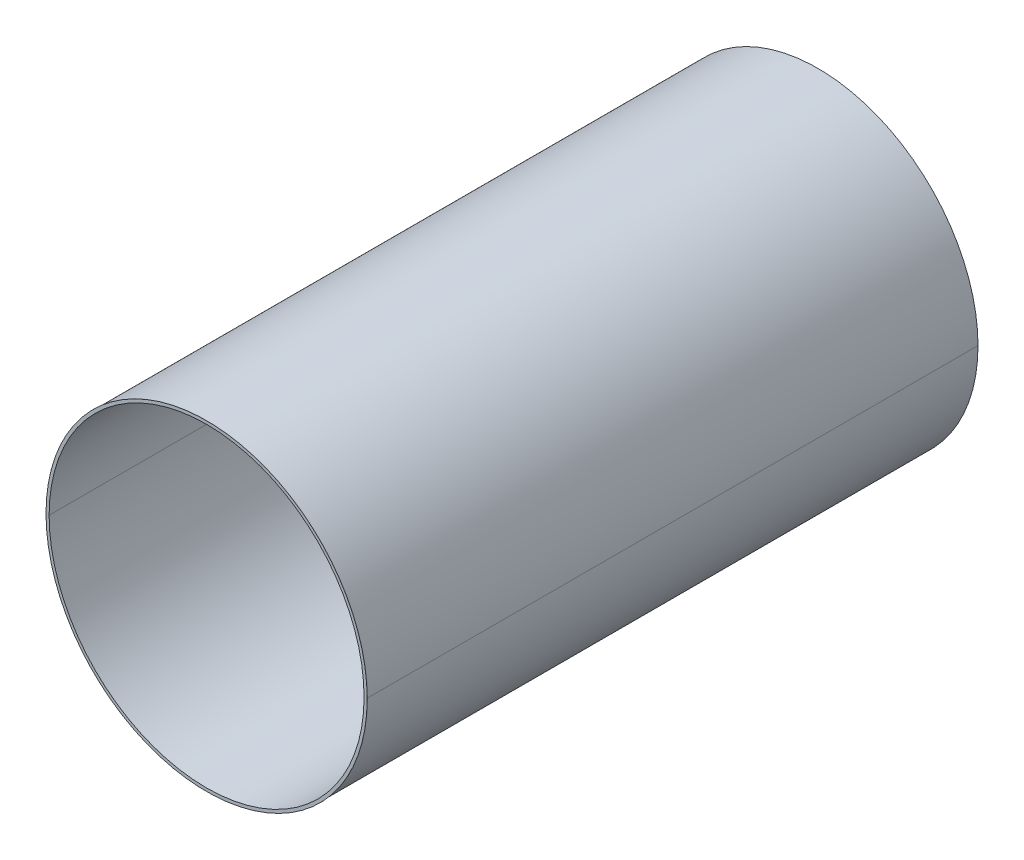
ISO-10303-21;
HEADER;
FILE_DESCRIPTION(('STEP AP214'),'2;1');
FILE_NAME('part.step','',(''),(''),'','','');
FILE_SCHEMA(('AUTOMOTIVE_DESIGN { 1 0 10303 214 1 1 1 1 }'));
ENDSEC;
DATA;
#1=APPLICATION_CONTEXT('core data for automotive mechanical design processes');
#2=APPLICATION_PROTOCOL_DEFINITION('international standard','automotive_design',2000,#1);
#3=PRODUCT_CONTEXT('',#1,'mechanical');
#4=PRODUCT('Part','Part','',(#3));
#5=PRODUCT_RELATED_PRODUCT_CATEGORY('part','',(#4));
#6=PRODUCT_DEFINITION_FORMATION('','',#4);
#7=PRODUCT_DEFINITION_CONTEXT('part definition',#1,'design');
#8=PRODUCT_DEFINITION('design','',#6,#7);
#9=PRODUCT_DEFINITION_SHAPE('','',#8);
#10=(LENGTH_UNIT() NAMED_UNIT(*) SI_UNIT(.MILLI.,.METRE.));
#11=(NAMED_UNIT(*) PLANE_ANGLE_UNIT() SI_UNIT($,.RADIAN.));
#12=(NAMED_UNIT(*) SI_UNIT($,.STERADIAN.) SOLID_ANGLE_UNIT());
#13=UNCERTAINTY_MEASURE_WITH_UNIT(LENGTH_MEASURE(1.E-05),#10,'distance_accuracy_value','');
#14=(GEOMETRIC_REPRESENTATION_CONTEXT(3) GLOBAL_UNCERTAINTY_ASSIGNED_CONTEXT((#13)) GLOBAL_UNIT_ASSIGNED_CONTEXT((#10,
#11,#12)) REPRESENTATION_CONTEXT('',''));
#15=CARTESIAN_POINT('',(0.,0.,0.));
#16=DIRECTION('',(0.,0.,1.));
#17=DIRECTION('',(1.,0.,0.));
#18=AXIS2_PLACEMENT_3D('',#15,#16,#17);
#19=CARTESIAN_POINT('',(-78.36,1.5875,-299.260099631724));
#20=DIRECTION('',(0.,0.,1.));
#21=DIRECTION('',(1.,0.,0.));
#22=AXIS2_PLACEMENT_3D('',#19,#20,#21);
#23=PLANE('',#22);
#24=CARTESIAN_POINT('',(-78.36,1.5875,-299.260099631724));
#25=DIRECTION('',(0.,0.,-1.));
#26=DIRECTION('',(1.,0.,0.));
#27=AXIS2_PLACEMENT_3D('',#24,#25,#26);
#28=CIRCLE('',#27,77.09);
#29=CARTESIAN_POINT('',(-1.27,1.5875,-299.260099631724));
#30=VERTEX_POINT('',#29);
#31=CARTESIAN_POINT('',(-155.45,1.5875,-299.260099631724));
#32=VERTEX_POINT('',#31);
#33=EDGE_CURVE('E118',#30,#32,#28,.T.);
#34=ORIENTED_EDGE('',*,*,#33,.F.);
#35=CARTESIAN_POINT('',(-78.36,1.5875,-299.260099631724));
#36=DIRECTION('',(0.,0.,-1.));
#37=DIRECTION('',(1.,0.,0.));
#38=AXIS2_PLACEMENT_3D('',#35,#36,#37);
#39=CIRCLE('',#38,77.09);
#40=EDGE_CURVE('E141',#32,#30,#39,.T.);
#41=ORIENTED_EDGE('',*,*,#40,.F.);
#42=EDGE_LOOP('',(#34,#41));
#43=FACE_BOUND('',#42,.T.);
#44=CARTESIAN_POINT('',(-78.36,1.5875,-299.260099631724));
#45=DIRECTION('',(0.,0.,-1.));
#46=DIRECTION('',(1.,0.,0.));
#47=AXIS2_PLACEMENT_3D('',#44,#45,#46);
#48=CIRCLE('',#47,78.36);
#49=CARTESIAN_POINT('',(0.,1.5875,-299.260099631724));
#50=VERTEX_POINT('',#49);
#51=CARTESIAN_POINT('',(-156.72,1.5875,-299.260099631724));
#52=VERTEX_POINT('',#51);
#53=EDGE_CURVE('E112',#50,#52,#48,.T.);
#54=ORIENTED_EDGE('',*,*,#53,.T.);
#55=CARTESIAN_POINT('',(-78.36,1.5875,-299.260099631724));
#56=DIRECTION('',(0.,0.,-1.));
#57=DIRECTION('',(1.,0.,0.));
#58=AXIS2_PLACEMENT_3D('',#55,#56,#57);
#59=CIRCLE('',#58,78.36);
#60=EDGE_CURVE('E103',#52,#50,#59,.T.);
#61=ORIENTED_EDGE('',*,*,#60,.T.);
#62=EDGE_LOOP('',(#54,#61));
#63=FACE_BOUND('',#62,.T.);
#64=ADVANCED_FACE('F16',(#43,#63),#23,.F.);
#65=CARTESIAN_POINT('',(0.,0.,-0.1));
#66=DIRECTION('',(0.,0.,1.));
#67=DIRECTION('',(1.,0.,0.));
#68=AXIS2_PLACEMENT_3D('',#65,#66,#67);
#69=PLANE('',#68);
#70=CARTESIAN_POINT('',(-78.36,1.5875,-0.099999999999989));
#71=DIRECTION('',(0.,0.,-1.));
#72=DIRECTION('',(1.,0.,0.));
#73=AXIS2_PLACEMENT_3D('',#70,#71,#72);
#74=CIRCLE('',#73,78.36);
#75=CARTESIAN_POINT('',(0.,1.5875,-0.099999999999989));
#76=VERTEX_POINT('',#75);
#77=CARTESIAN_POINT('',(-156.72,1.5875,-0.099999999999989));
#78=VERTEX_POINT('',#77);
#79=EDGE_CURVE('E115',#76,#78,#74,.T.);
#80=ORIENTED_EDGE('',*,*,#79,.F.);
#81=CARTESIAN_POINT('',(-78.36,1.5875,-0.099999999999989));
#82=DIRECTION('',(0.,0.,-1.));
#83=DIRECTION('',(1.,0.,0.));
#84=AXIS2_PLACEMENT_3D('',#81,#82,#83);
#85=CIRCLE('',#84,78.36);
#86=EDGE_CURVE('E131',#78,#76,#85,.T.);
#87=ORIENTED_EDGE('',*,*,#86,.F.);
#88=EDGE_LOOP('',(#80,#87));
#89=FACE_BOUND('',#88,.T.);
#90=CARTESIAN_POINT('',(-78.36,1.5875,-0.1));
#91=DIRECTION('',(0.,0.,1.));
#92=DIRECTION('',(1.,0.,0.));
#93=AXIS2_PLACEMENT_3D('',#90,#91,#92);
#94=CIRCLE('',#93,78.614);
#95=CARTESIAN_POINT('',(0.254000000000004,1.5875,-0.1));
#96=VERTEX_POINT('',#95);
#97=CARTESIAN_POINT('',(-156.974,1.5875,-0.1));
#98=VERTEX_POINT('',#97);
#99=EDGE_CURVE('E99',#96,#98,#94,.T.);
#100=ORIENTED_EDGE('',*,*,#99,.F.);
#101=CARTESIAN_POINT('',(-78.36,1.5875,-0.1));
#102=DIRECTION('',(0.,0.,1.));
#103=DIRECTION('',(1.,0.,0.));
#104=AXIS2_PLACEMENT_3D('',#101,#102,#103);
#105=CIRCLE('',#104,78.614);
#106=EDGE_CURVE('E10',#98,#96,#105,.T.);
#107=ORIENTED_EDGE('',*,*,#106,.F.);
#108=EDGE_LOOP('',(#100,#107));
#109=FACE_BOUND('',#108,.T.);
#110=ADVANCED_FACE('F18',(#89,#109),#69,.F.);
#111=CARTESIAN_POINT('',(-78.36,1.5875,-0.1));
#112=DIRECTION('',(0.,0.,1.));
#113=DIRECTION('',(1.,0.,0.));
#114=AXIS2_PLACEMENT_3D('',#111,#112,#113);
#115=CYLINDRICAL_SURFACE('',#114,78.614);
#116=DIRECTION('',(0.,0.,1.));
#117=VECTOR('',#116,1.);
#118=CARTESIAN_POINT('',(-156.974,1.5875,-0.1));
#119=LINE('',#118,#117);
#120=CARTESIAN_POINT('',(-156.974,1.5875,0.));
#121=VERTEX_POINT('',#120);
#122=EDGE_CURVE('E93',#98,#121,#119,.T.);
#123=ORIENTED_EDGE('',*,*,#122,.F.);
#124=ORIENTED_EDGE('',*,*,#106,.T.);
#125=DIRECTION('',(0.,0.,1.));
#126=VECTOR('',#125,1.);
#127=CARTESIAN_POINT('',(0.254000000000004,1.5875,-0.1));
#128=LINE('',#127,#126);
#129=CARTESIAN_POINT('',(0.254000000000004,1.5875,0.));
#130=VERTEX_POINT('',#129);
#131=EDGE_CURVE('E90',#96,#130,#128,.T.);
#132=ORIENTED_EDGE('',*,*,#131,.T.);
#133=CARTESIAN_POINT('',(-78.36,1.5875,0.));
#134=DIRECTION('',(0.,0.,1.));
#135=DIRECTION('',(1.,0.,0.));
#136=AXIS2_PLACEMENT_3D('',#133,#134,#135);
#137=CIRCLE('',#136,78.614);
#138=EDGE_CURVE('E25',#121,#130,#137,.T.);
#139=ORIENTED_EDGE('',*,*,#138,.F.);
#140=EDGE_LOOP('',(#123,#124,#132,#139));
#141=FACE_BOUND('',#140,.T.);
#142=ADVANCED_FACE('F89',(#141),#115,.T.);
#143=CARTESIAN_POINT('',(-78.36,1.5875,0.));
#144=DIRECTION('',(0.,0.,1.));
#145=DIRECTION('',(1.,0.,0.));
#146=AXIS2_PLACEMENT_3D('',#143,#144,#145);
#147=PLANE('',#146);
#148=CARTESIAN_POINT('',(-78.36,1.5875,0.));
#149=DIRECTION('',(0.,0.,1.));
#150=DIRECTION('',(1.,0.,0.));
#151=AXIS2_PLACEMENT_3D('',#148,#149,#150);
#152=CIRCLE('',#151,77.09);
#153=CARTESIAN_POINT('',(-1.27,1.5875,0.));
#154=VERTEX_POINT('',#153);
#155=CARTESIAN_POINT('',(-155.45,1.5875,0.));
#156=VERTEX_POINT('',#155);
#157=EDGE_CURVE('E37',#154,#156,#152,.T.);
#158=ORIENTED_EDGE('',*,*,#157,.F.);
#159=CARTESIAN_POINT('',(-78.36,1.5875,0.));
#160=DIRECTION('',(0.,0.,1.));
#161=DIRECTION('',(1.,0.,0.));
#162=AXIS2_PLACEMENT_3D('',#159,#160,#161);
#163=CIRCLE('',#162,77.09);
#164=EDGE_CURVE('E142',#156,#154,#163,.T.);
#165=ORIENTED_EDGE('',*,*,#164,.F.);
#166=EDGE_LOOP('',(#158,#165));
#167=FACE_BOUND('',#166,.T.);
#168=CARTESIAN_POINT('',(-78.36,1.5875,0.));
#169=DIRECTION('',(0.,0.,1.));
#170=DIRECTION('',(1.,0.,0.));
#171=AXIS2_PLACEMENT_3D('',#168,#169,#170);
#172=CIRCLE('',#171,78.614);
#173=EDGE_CURVE('E101',#130,#121,#172,.T.);
#174=ORIENTED_EDGE('',*,*,#173,.T.);
#175=ORIENTED_EDGE('',*,*,#138,.T.);
#176=EDGE_LOOP('',(#174,#175));
#177=FACE_BOUND('',#176,.T.);
#178=ADVANCED_FACE('F158',(#167,#177),#147,.T.);
#179=CARTESIAN_POINT('',(-78.36,1.5875,-914.4));
#180=DIRECTION('',(0.,0.,1.));
#181=DIRECTION('',(1.,0.,0.));
#182=AXIS2_PLACEMENT_3D('',#179,#180,#181);
#183=CYLINDRICAL_SURFACE('',#182,78.36);
#184=DIRECTION('',(0.,0.,1.));
#185=VECTOR('',#184,1.);
#186=CARTESIAN_POINT('',(-156.72,1.5875,-914.4));
#187=LINE('',#186,#185);
#188=EDGE_CURVE('E127',#52,#78,#187,.T.);
#189=ORIENTED_EDGE('',*,*,#188,.F.);
#190=ORIENTED_EDGE('',*,*,#53,.F.);
#191=DIRECTION('',(0.,0.,1.));
#192=VECTOR('',#191,1.);
#193=CARTESIAN_POINT('',(0.,1.5875,-914.4));
#194=LINE('',#193,#192);
#195=EDGE_CURVE('E123',#50,#76,#194,.T.);
#196=ORIENTED_EDGE('',*,*,#195,.T.);
#197=ORIENTED_EDGE('',*,*,#79,.T.);
#198=EDGE_LOOP('',(#189,#190,#196,#197));
#199=FACE_BOUND('',#198,.T.);
#200=ADVANCED_FACE('F160',(#199),#183,.T.);
#201=CARTESIAN_POINT('',(-78.36,1.5875,-914.4));
#202=DIRECTION('',(0.,0.,1.));
#203=DIRECTION('',(1.,0.,0.));
#204=AXIS2_PLACEMENT_3D('',#201,#202,#203);
#205=CYLINDRICAL_SURFACE('',#204,77.09);
#206=DIRECTION('',(0.,0.,1.));
#207=VECTOR('',#206,1.);
#208=CARTESIAN_POINT('',(-155.45,1.5875,-914.4));
#209=LINE('',#208,#207);
#210=EDGE_CURVE('E122',#32,#156,#209,.T.);
#211=ORIENTED_EDGE('',*,*,#210,.F.);
#212=ORIENTED_EDGE('',*,*,#40,.T.);
#213=DIRECTION('',(0.,0.,1.));
#214=VECTOR('',#213,1.);
#215=CARTESIAN_POINT('',(-1.27,1.5875,-914.4));
#216=LINE('',#215,#214);
#217=EDGE_CURVE('E138',#30,#154,#216,.T.);
#218=ORIENTED_EDGE('',*,*,#217,.T.);
#219=ORIENTED_EDGE('',*,*,#157,.T.);
#220=EDGE_LOOP('',(#211,#212,#218,#219));
#221=FACE_BOUND('',#220,.T.);
#222=ADVANCED_FACE('F167',(#221),#205,.F.);
#223=CARTESIAN_POINT('',(-78.36,1.5875,-914.4));
#224=DIRECTION('',(0.,0.,1.));
#225=DIRECTION('',(1.,0.,0.));
#226=AXIS2_PLACEMENT_3D('',#223,#224,#225);
#227=CYLINDRICAL_SURFACE('',#226,77.09);
#228=ORIENTED_EDGE('',*,*,#33,.T.);
#229=ORIENTED_EDGE('',*,*,#210,.T.);
#230=ORIENTED_EDGE('',*,*,#164,.T.);
#231=ORIENTED_EDGE('',*,*,#217,.F.);
#232=EDGE_LOOP('',(#228,#229,#230,#231));
#233=FACE_BOUND('',#232,.T.);
#234=ADVANCED_FACE('F182',(#233),#227,.F.);
#235=CARTESIAN_POINT('',(-78.36,1.5875,-914.4));
#236=DIRECTION('',(0.,0.,1.));
#237=DIRECTION('',(1.,0.,0.));
#238=AXIS2_PLACEMENT_3D('',#235,#236,#237);
#239=CYLINDRICAL_SURFACE('',#238,78.36);
#240=ORIENTED_EDGE('',*,*,#60,.F.);
#241=ORIENTED_EDGE('',*,*,#188,.T.);
#242=ORIENTED_EDGE('',*,*,#86,.T.);
#243=ORIENTED_EDGE('',*,*,#195,.F.);
#244=EDGE_LOOP('',(#240,#241,#242,#243));
#245=FACE_BOUND('',#244,.T.);
#246=ADVANCED_FACE('F183',(#245),#239,.T.);
#247=CARTESIAN_POINT('',(-78.36,1.5875,-0.1));
#248=DIRECTION('',(0.,0.,1.));
#249=DIRECTION('',(1.,0.,0.));
#250=AXIS2_PLACEMENT_3D('',#247,#248,#249);
#251=CYLINDRICAL_SURFACE('',#250,78.614);
#252=ORIENTED_EDGE('',*,*,#99,.T.);
#253=ORIENTED_EDGE('',*,*,#122,.T.);
#254=ORIENTED_EDGE('',*,*,#173,.F.);
#255=ORIENTED_EDGE('',*,*,#131,.F.);
#256=EDGE_LOOP('',(#252,#253,#254,#255));
#257=FACE_BOUND('',#256,.T.);
#258=ADVANCED_FACE('F98',(#257),#251,.T.);
#259=CLOSED_SHELL('',(#64,#110,#142,#178,#200,#222,#234,#246,#258));
#260=MANIFOLD_SOLID_BREP('B1',#259);
#261=ADVANCED_BREP_SHAPE_REPRESENTATION('',(#18,#260),#14);
#262=SHAPE_DEFINITION_REPRESENTATION(#9,#261);
ENDSEC;
END-ISO-10303-21;
